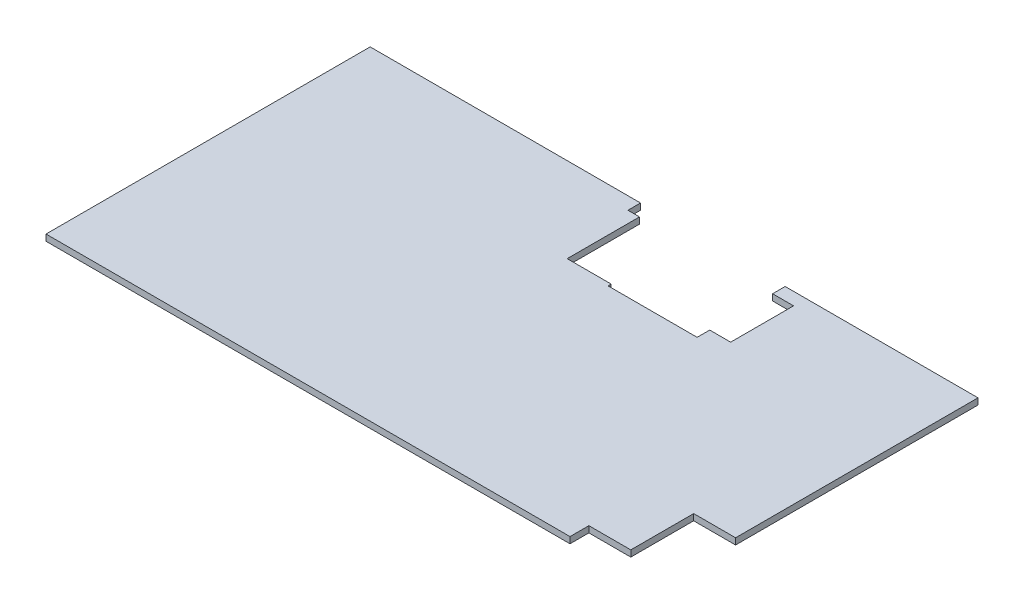
ISO-10303-21;
HEADER;
FILE_DESCRIPTION(('STEP AP214'),'2;1');
FILE_NAME('part.step','',(''),(''),'','','');
FILE_SCHEMA(('AUTOMOTIVE_DESIGN { 1 0 10303 214 1 1 1 1 }'));
ENDSEC;
DATA;
#1=APPLICATION_CONTEXT('core data for automotive mechanical design processes');
#2=APPLICATION_PROTOCOL_DEFINITION('international standard','automotive_design',2000,#1);
#3=PRODUCT_CONTEXT('',#1,'mechanical');
#4=PRODUCT('Part','Part','',(#3));
#5=PRODUCT_RELATED_PRODUCT_CATEGORY('part','',(#4));
#6=PRODUCT_DEFINITION_FORMATION('','',#4);
#7=PRODUCT_DEFINITION_CONTEXT('part definition',#1,'design');
#8=PRODUCT_DEFINITION('design','',#6,#7);
#9=PRODUCT_DEFINITION_SHAPE('','',#8);
#10=(LENGTH_UNIT() NAMED_UNIT(*) SI_UNIT(.MILLI.,.METRE.));
#11=(NAMED_UNIT(*) PLANE_ANGLE_UNIT() SI_UNIT($,.RADIAN.));
#12=(NAMED_UNIT(*) SI_UNIT($,.STERADIAN.) SOLID_ANGLE_UNIT());
#13=UNCERTAINTY_MEASURE_WITH_UNIT(LENGTH_MEASURE(1.E-05),#10,'distance_accuracy_value','');
#14=(GEOMETRIC_REPRESENTATION_CONTEXT(3) GLOBAL_UNCERTAINTY_ASSIGNED_CONTEXT((#13)) GLOBAL_UNIT_ASSIGNED_CONTEXT((#10,
#11,#12)) REPRESENTATION_CONTEXT('',''));
#15=CARTESIAN_POINT('',(0.,0.,0.));
#16=DIRECTION('',(0.,0.,1.));
#17=DIRECTION('',(1.,0.,0.));
#18=AXIS2_PLACEMENT_3D('',#15,#16,#17);
#19=CARTESIAN_POINT('',(0.,3.,0.));
#20=DIRECTION('',(0.,-1.,0.));
#21=DIRECTION('',(0.,0.,-1.));
#22=AXIS2_PLACEMENT_3D('',#19,#20,#21);
#23=PLANE('',#22);
#24=DIRECTION('',(1.,0.,0.));
#25=VECTOR('',#24,1.);
#26=CARTESIAN_POINT('',(145.,3.,68.325));
#27=LINE('',#26,#25);
#28=CARTESIAN_POINT('',(105.,3.,68.325));
#29=VERTEX_POINT('',#28);
#30=CARTESIAN_POINT('',(125.,3.,68.325));
#31=VERTEX_POINT('',#30);
#32=EDGE_CURVE('E268',#29,#31,#27,.T.);
#33=ORIENTED_EDGE('',*,*,#32,.T.);
#34=DIRECTION('',(0.,0.,1.));
#35=VECTOR('',#34,1.);
#36=CARTESIAN_POINT('',(125.,3.,68.325));
#37=LINE('',#36,#35);
#38=CARTESIAN_POINT('',(125.,3.,38.325));
#39=VERTEX_POINT('',#38);
#40=EDGE_CURVE('E51',#39,#31,#37,.T.);
#41=ORIENTED_EDGE('',*,*,#40,.F.);
#42=DIRECTION('',(-1.,0.,0.));
#43=VECTOR('',#42,1.);
#44=CARTESIAN_POINT('',(145.,3.,38.325));
#45=LINE('',#44,#43);
#46=CARTESIAN_POINT('',(145.,3.,38.325));
#47=VERTEX_POINT('',#46);
#48=EDGE_CURVE('E257',#47,#39,#45,.T.);
#49=ORIENTED_EDGE('',*,*,#48,.F.);
#50=DIRECTION('',(0.,0.,-1.));
#51=VECTOR('',#50,1.);
#52=CARTESIAN_POINT('',(145.,3.,-77.325));
#53=LINE('',#52,#51);
#54=CARTESIAN_POINT('',(145.,3.,-77.325));
#55=VERTEX_POINT('',#54);
#56=EDGE_CURVE('E191',#47,#55,#53,.T.);
#57=ORIENTED_EDGE('',*,*,#56,.T.);
#58=DIRECTION('',(-1.,0.,0.));
#59=VECTOR('',#58,1.);
#60=CARTESIAN_POINT('',(145.,3.,-77.325));
#61=LINE('',#60,#59);
#62=CARTESIAN_POINT('',(53.,3.,-77.325));
#63=VERTEX_POINT('',#62);
#64=EDGE_CURVE('E210',#55,#63,#61,.T.);
#65=ORIENTED_EDGE('',*,*,#64,.T.);
#66=DIRECTION('',(0.,0.,1.));
#67=VECTOR('',#66,1.);
#68=CARTESIAN_POINT('',(53.,3.,0.));
#69=LINE('',#68,#67);
#70=CARTESIAN_POINT('',(53.,3.,-71.325));
#71=VERTEX_POINT('',#70);
#72=EDGE_CURVE('E326',#63,#71,#69,.T.);
#73=ORIENTED_EDGE('',*,*,#72,.T.);
#74=DIRECTION('',(-1.,0.,0.));
#75=VECTOR('',#74,1.);
#76=CARTESIAN_POINT('',(0.,3.,-71.325));
#77=LINE('',#76,#75);
#78=CARTESIAN_POINT('',(63.,3.,-71.325));
#79=VERTEX_POINT('',#78);
#80=EDGE_CURVE('E59',#79,#71,#77,.T.);
#81=ORIENTED_EDGE('',*,*,#80,.F.);
#82=DIRECTION('',(0.,0.,-1.));
#83=VECTOR('',#82,1.);
#84=CARTESIAN_POINT('',(63.,3.,0.));
#85=LINE('',#84,#83);
#86=CARTESIAN_POINT('',(63.,3.,-41.325));
#87=VERTEX_POINT('',#86);
#88=EDGE_CURVE('E278',#87,#79,#85,.T.);
#89=ORIENTED_EDGE('',*,*,#88,.F.);
#90=DIRECTION('',(-1.,0.,0.));
#91=VECTOR('',#90,1.);
#92=CARTESIAN_POINT('',(0.,3.,-41.325));
#93=LINE('',#92,#91);
#94=CARTESIAN_POINT('',(53.,3.,-41.325));
#95=VERTEX_POINT('',#94);
#96=EDGE_CURVE('E284',#87,#95,#93,.T.);
#97=ORIENTED_EDGE('',*,*,#96,.T.);
#98=CARTESIAN_POINT('',(53.,3.,-35.325));
#99=VERTEX_POINT('',#98);
#100=EDGE_CURVE('E325',#95,#99,#69,.T.);
#101=ORIENTED_EDGE('',*,*,#100,.T.);
#102=DIRECTION('',(1.,0.,0.));
#103=VECTOR('',#102,1.);
#104=CARTESIAN_POINT('',(0.,3.,-35.325));
#105=LINE('',#104,#103);
#106=CARTESIAN_POINT('',(10.5,3.,-35.325));
#107=VERTEX_POINT('',#106);
#108=EDGE_CURVE('E297',#107,#99,#105,.T.);
#109=ORIENTED_EDGE('',*,*,#108,.F.);
#110=DIRECTION('',(0.,0.,1.));
#111=VECTOR('',#110,1.);
#112=CARTESIAN_POINT('',(10.5,3.,0.));
#113=LINE('',#112,#111);
#114=CARTESIAN_POINT('',(10.5,3.,-36.825));
#115=VERTEX_POINT('',#114);
#116=EDGE_CURVE('E237',#115,#107,#113,.T.);
#117=ORIENTED_EDGE('',*,*,#116,.F.);
#118=DIRECTION('',(1.,0.,0.));
#119=VECTOR('',#118,1.);
#120=CARTESIAN_POINT('',(0.,3.,-36.825));
#121=LINE('',#120,#119);
#122=CARTESIAN_POINT('',(-10.5,3.,-36.825));
#123=VERTEX_POINT('',#122);
#124=EDGE_CURVE('E336',#123,#115,#121,.T.);
#125=ORIENTED_EDGE('',*,*,#124,.F.);
#126=DIRECTION('',(0.,0.,1.));
#127=VECTOR('',#126,1.);
#128=CARTESIAN_POINT('',(-10.5,3.,0.));
#129=LINE('',#128,#127);
#130=CARTESIAN_POINT('',(-10.5,3.,-71.325));
#131=VERTEX_POINT('',#130);
#132=EDGE_CURVE('E334',#131,#123,#129,.T.);
#133=ORIENTED_EDGE('',*,*,#132,.F.);
#134=DIRECTION('',(1.,0.,0.));
#135=VECTOR('',#134,1.);
#136=CARTESIAN_POINT('',(0.,3.,-71.325));
#137=LINE('',#136,#135);
#138=CARTESIAN_POINT('',(-16.,3.,-71.325));
#139=VERTEX_POINT('',#138);
#140=EDGE_CURVE('E331',#139,#131,#137,.T.);
#141=ORIENTED_EDGE('',*,*,#140,.F.);
#142=DIRECTION('',(0.,0.,1.));
#143=VECTOR('',#142,1.);
#144=CARTESIAN_POINT('',(-16.,3.,0.));
#145=LINE('',#144,#143);
#146=CARTESIAN_POINT('',(-16.,3.,-77.325));
#147=VERTEX_POINT('',#146);
#148=EDGE_CURVE('E328',#147,#139,#145,.T.);
#149=ORIENTED_EDGE('',*,*,#148,.F.);
#150=CARTESIAN_POINT('',(-145.,3.,-77.325));
#151=VERTEX_POINT('',#150);
#152=EDGE_CURVE('E219',#147,#151,#61,.T.);
#153=ORIENTED_EDGE('',*,*,#152,.T.);
#154=DIRECTION('',(0.,0.,1.));
#155=VECTOR('',#154,1.);
#156=CARTESIAN_POINT('',(-145.,3.,-77.325));
#157=LINE('',#156,#155);
#158=CARTESIAN_POINT('',(-145.,3.,77.325));
#159=VERTEX_POINT('',#158);
#160=EDGE_CURVE('E207',#151,#159,#157,.T.);
#161=ORIENTED_EDGE('',*,*,#160,.T.);
#162=DIRECTION('',(1.,0.,0.));
#163=VECTOR('',#162,1.);
#164=CARTESIAN_POINT('',(145.,3.,77.325));
#165=LINE('',#164,#163);
#166=CARTESIAN_POINT('',(105.,3.,77.325));
#167=VERTEX_POINT('',#166);
#168=EDGE_CURVE('E253',#159,#167,#165,.T.);
#169=ORIENTED_EDGE('',*,*,#168,.T.);
#170=DIRECTION('',(0.,0.,-1.));
#171=VECTOR('',#170,1.);
#172=CARTESIAN_POINT('',(105.,3.,77.325));
#173=LINE('',#172,#171);
#174=EDGE_CURVE('E266',#167,#29,#173,.T.);
#175=ORIENTED_EDGE('',*,*,#174,.T.);
#176=EDGE_LOOP('',(#33,#41,#49,#57,#65,#73,#81,#89,#97,#101,#109,#117,#125,#133,#141,#149,#153,
#161,#169,#175));
#177=FACE_BOUND('',#176,.T.);
#178=ADVANCED_FACE('F36',(#177),#23,.F.);
#179=CARTESIAN_POINT('',(0.,0.,0.));
#180=DIRECTION('',(0.,-1.,0.));
#181=DIRECTION('',(0.,0.,-1.));
#182=AXIS2_PLACEMENT_3D('',#179,#180,#181);
#183=PLANE('',#182);
#184=DIRECTION('',(0.,0.,1.));
#185=VECTOR('',#184,1.);
#186=CARTESIAN_POINT('',(125.,0.,68.325));
#187=LINE('',#186,#185);
#188=CARTESIAN_POINT('',(125.,0.,38.325));
#189=VERTEX_POINT('',#188);
#190=CARTESIAN_POINT('',(125.,0.,68.325));
#191=VERTEX_POINT('',#190);
#192=EDGE_CURVE('E183',#189,#191,#187,.T.);
#193=ORIENTED_EDGE('',*,*,#192,.T.);
#194=DIRECTION('',(1.,0.,0.));
#195=VECTOR('',#194,1.);
#196=CARTESIAN_POINT('',(145.,0.,68.325));
#197=LINE('',#196,#195);
#198=CARTESIAN_POINT('',(105.,0.,68.325));
#199=VERTEX_POINT('',#198);
#200=EDGE_CURVE('E269',#199,#191,#197,.T.);
#201=ORIENTED_EDGE('',*,*,#200,.F.);
#202=DIRECTION('',(0.,0.,-1.));
#203=VECTOR('',#202,1.);
#204=CARTESIAN_POINT('',(105.,0.,77.325));
#205=LINE('',#204,#203);
#206=CARTESIAN_POINT('',(105.,0.,77.325));
#207=VERTEX_POINT('',#206);
#208=EDGE_CURVE('E264',#207,#199,#205,.T.);
#209=ORIENTED_EDGE('',*,*,#208,.F.);
#210=DIRECTION('',(1.,0.,0.));
#211=VECTOR('',#210,1.);
#212=CARTESIAN_POINT('',(145.,0.,77.325));
#213=LINE('',#212,#211);
#214=CARTESIAN_POINT('',(-145.,0.,77.325));
#215=VERTEX_POINT('',#214);
#216=EDGE_CURVE('E199',#215,#207,#213,.T.);
#217=ORIENTED_EDGE('',*,*,#216,.F.);
#218=DIRECTION('',(0.,0.,1.));
#219=VECTOR('',#218,1.);
#220=CARTESIAN_POINT('',(-145.,0.,-77.325));
#221=LINE('',#220,#219);
#222=CARTESIAN_POINT('',(-145.,0.,-77.325));
#223=VERTEX_POINT('',#222);
#224=EDGE_CURVE('E203',#223,#215,#221,.T.);
#225=ORIENTED_EDGE('',*,*,#224,.F.);
#226=DIRECTION('',(-1.,0.,0.));
#227=VECTOR('',#226,1.);
#228=CARTESIAN_POINT('',(145.,0.,-77.325));
#229=LINE('',#228,#227);
#230=CARTESIAN_POINT('',(-16.,0.,-77.325));
#231=VERTEX_POINT('',#230);
#232=EDGE_CURVE('E198',#231,#223,#229,.T.);
#233=ORIENTED_EDGE('',*,*,#232,.F.);
#234=DIRECTION('',(0.,0.,1.));
#235=VECTOR('',#234,1.);
#236=CARTESIAN_POINT('',(-16.,0.,0.));
#237=LINE('',#236,#235);
#238=CARTESIAN_POINT('',(-16.,0.,-71.325));
#239=VERTEX_POINT('',#238);
#240=EDGE_CURVE('E310',#231,#239,#237,.T.);
#241=ORIENTED_EDGE('',*,*,#240,.T.);
#242=DIRECTION('',(1.,0.,0.));
#243=VECTOR('',#242,1.);
#244=CARTESIAN_POINT('',(0.,0.,-71.325));
#245=LINE('',#244,#243);
#246=CARTESIAN_POINT('',(-10.5,0.,-71.325));
#247=VERTEX_POINT('',#246);
#248=EDGE_CURVE('E313',#239,#247,#245,.T.);
#249=ORIENTED_EDGE('',*,*,#248,.T.);
#250=DIRECTION('',(0.,0.,1.));
#251=VECTOR('',#250,1.);
#252=CARTESIAN_POINT('',(-10.5,0.,0.));
#253=LINE('',#252,#251);
#254=CARTESIAN_POINT('',(-10.5,0.,-36.825));
#255=VERTEX_POINT('',#254);
#256=EDGE_CURVE('E316',#247,#255,#253,.T.);
#257=ORIENTED_EDGE('',*,*,#256,.T.);
#258=DIRECTION('',(1.,0.,0.));
#259=VECTOR('',#258,1.);
#260=CARTESIAN_POINT('',(0.,0.,-36.825));
#261=LINE('',#260,#259);
#262=CARTESIAN_POINT('',(10.5,0.,-36.825));
#263=VERTEX_POINT('',#262);
#264=EDGE_CURVE('E319',#255,#263,#261,.T.);
#265=ORIENTED_EDGE('',*,*,#264,.T.);
#266=DIRECTION('',(0.,0.,1.));
#267=VECTOR('',#266,1.);
#268=CARTESIAN_POINT('',(10.5,0.,0.));
#269=LINE('',#268,#267);
#270=CARTESIAN_POINT('',(10.5,0.,-35.325));
#271=VERTEX_POINT('',#270);
#272=EDGE_CURVE('E251',#263,#271,#269,.T.);
#273=ORIENTED_EDGE('',*,*,#272,.T.);
#274=DIRECTION('',(1.,0.,0.));
#275=VECTOR('',#274,1.);
#276=CARTESIAN_POINT('',(0.,0.,-35.325));
#277=LINE('',#276,#275);
#278=CARTESIAN_POINT('',(53.,0.,-35.325));
#279=VERTEX_POINT('',#278);
#280=EDGE_CURVE('E303',#271,#279,#277,.T.);
#281=ORIENTED_EDGE('',*,*,#280,.T.);
#282=DIRECTION('',(0.,0.,1.));
#283=VECTOR('',#282,1.);
#284=CARTESIAN_POINT('',(53.,0.,0.));
#285=LINE('',#284,#283);
#286=CARTESIAN_POINT('',(53.,0.,-41.325));
#287=VERTEX_POINT('',#286);
#288=EDGE_CURVE('E306',#287,#279,#285,.T.);
#289=ORIENTED_EDGE('',*,*,#288,.F.);
#290=DIRECTION('',(-1.,0.,0.));
#291=VECTOR('',#290,1.);
#292=CARTESIAN_POINT('',(0.,0.,-41.325));
#293=LINE('',#292,#291);
#294=CARTESIAN_POINT('',(63.,0.,-41.325));
#295=VERTEX_POINT('',#294);
#296=EDGE_CURVE('E287',#295,#287,#293,.T.);
#297=ORIENTED_EDGE('',*,*,#296,.F.);
#298=DIRECTION('',(0.,0.,-1.));
#299=VECTOR('',#298,1.);
#300=CARTESIAN_POINT('',(63.,0.,0.));
#301=LINE('',#300,#299);
#302=CARTESIAN_POINT('',(63.,0.,-71.325));
#303=VERTEX_POINT('',#302);
#304=EDGE_CURVE('E280',#295,#303,#301,.T.);
#305=ORIENTED_EDGE('',*,*,#304,.T.);
#306=DIRECTION('',(-1.,0.,0.));
#307=VECTOR('',#306,1.);
#308=CARTESIAN_POINT('',(0.,0.,-71.325));
#309=LINE('',#308,#307);
#310=CARTESIAN_POINT('',(53.,0.,-71.325));
#311=VERTEX_POINT('',#310);
#312=EDGE_CURVE('E283',#303,#311,#309,.T.);
#313=ORIENTED_EDGE('',*,*,#312,.T.);
#314=CARTESIAN_POINT('',(53.,0.,-77.325));
#315=VERTEX_POINT('',#314);
#316=EDGE_CURVE('E307',#315,#311,#285,.T.);
#317=ORIENTED_EDGE('',*,*,#316,.F.);
#318=CARTESIAN_POINT('',(145.,0.,-77.325));
#319=VERTEX_POINT('',#318);
#320=EDGE_CURVE('E197',#319,#315,#229,.T.);
#321=ORIENTED_EDGE('',*,*,#320,.F.);
#322=DIRECTION('',(0.,0.,-1.));
#323=VECTOR('',#322,1.);
#324=CARTESIAN_POINT('',(145.,0.,-77.325));
#325=LINE('',#324,#323);
#326=CARTESIAN_POINT('',(145.,0.,38.325));
#327=VERTEX_POINT('',#326);
#328=EDGE_CURVE('E189',#327,#319,#325,.T.);
#329=ORIENTED_EDGE('',*,*,#328,.F.);
#330=DIRECTION('',(-1.,0.,0.));
#331=VECTOR('',#330,1.);
#332=CARTESIAN_POINT('',(145.,0.,38.325));
#333=LINE('',#332,#331);
#334=EDGE_CURVE('E172',#327,#189,#333,.T.);
#335=ORIENTED_EDGE('',*,*,#334,.T.);
#336=EDGE_LOOP('',(#193,#201,#209,#217,#225,#233,#241,#249,#257,#265,#273,#281,#289,#297,#305,
#313,#317,#321,#329,#335));
#337=FACE_BOUND('',#336,.T.);
#338=ADVANCED_FACE('F194',(#337),#183,.T.);
#339=CARTESIAN_POINT('',(53.,0.,0.));
#340=DIRECTION('',(-1.,0.,0.));
#341=DIRECTION('',(0.,0.,1.));
#342=AXIS2_PLACEMENT_3D('',#339,#340,#341);
#343=PLANE('',#342);
#344=ORIENTED_EDGE('',*,*,#100,.F.);
#345=DIRECTION('',(0.,1.,0.));
#346=VECTOR('',#345,1.);
#347=CARTESIAN_POINT('',(53.,0.,-41.325));
#348=LINE('',#347,#346);
#349=EDGE_CURVE('E298',#287,#95,#348,.T.);
#350=ORIENTED_EDGE('',*,*,#349,.F.);
#351=ORIENTED_EDGE('',*,*,#288,.T.);
#352=DIRECTION('',(0.,1.,0.));
#353=VECTOR('',#352,1.);
#354=CARTESIAN_POINT('',(53.,0.,-35.325));
#355=LINE('',#354,#353);
#356=EDGE_CURVE('E248',#279,#99,#355,.T.);
#357=ORIENTED_EDGE('',*,*,#356,.T.);
#358=EDGE_LOOP('',(#344,#350,#351,#357));
#359=FACE_BOUND('',#358,.T.);
#360=ADVANCED_FACE('F381',(#359),#343,.T.);
#361=CARTESIAN_POINT('',(145.,3.,-77.325));
#362=DIRECTION('',(0.,0.,1.));
#363=DIRECTION('',(1.,0.,0.));
#364=AXIS2_PLACEMENT_3D('',#361,#362,#363);
#365=PLANE('',#364);
#366=DIRECTION('',(0.,1.,0.));
#367=VECTOR('',#366,1.);
#368=CARTESIAN_POINT('',(53.,0.,-77.325));
#369=LINE('',#368,#367);
#370=EDGE_CURVE('E216',#315,#63,#369,.T.);
#371=ORIENTED_EDGE('',*,*,#370,.T.);
#372=ORIENTED_EDGE('',*,*,#64,.F.);
#373=DIRECTION('',(0.,-1.,0.));
#374=VECTOR('',#373,1.);
#375=CARTESIAN_POINT('',(145.,3.,-77.325));
#376=LINE('',#375,#374);
#377=EDGE_CURVE('E44',#55,#319,#376,.T.);
#378=ORIENTED_EDGE('',*,*,#377,.T.);
#379=ORIENTED_EDGE('',*,*,#320,.T.);
#380=EDGE_LOOP('',(#371,#372,#378,#379));
#381=FACE_BOUND('',#380,.T.);
#382=ADVANCED_FACE('F214',(#381),#365,.F.);
#383=CARTESIAN_POINT('',(-145.,3.,-77.325));
#384=DIRECTION('',(1.,0.,0.));
#385=DIRECTION('',(0.,0.,-1.));
#386=AXIS2_PLACEMENT_3D('',#383,#384,#385);
#387=PLANE('',#386);
#388=ORIENTED_EDGE('',*,*,#224,.T.);
#389=DIRECTION('',(0.,-1.,0.));
#390=VECTOR('',#389,1.);
#391=CARTESIAN_POINT('',(-145.,3.,77.325));
#392=LINE('',#391,#390);
#393=EDGE_CURVE('E11',#159,#215,#392,.T.);
#394=ORIENTED_EDGE('',*,*,#393,.F.);
#395=ORIENTED_EDGE('',*,*,#160,.F.);
#396=DIRECTION('',(0.,-1.,0.));
#397=VECTOR('',#396,1.);
#398=CARTESIAN_POINT('',(-145.,3.,-77.325));
#399=LINE('',#398,#397);
#400=EDGE_CURVE('E208',#151,#223,#399,.T.);
#401=ORIENTED_EDGE('',*,*,#400,.T.);
#402=EDGE_LOOP('',(#388,#394,#395,#401));
#403=FACE_BOUND('',#402,.T.);
#404=ADVANCED_FACE('F38',(#403),#387,.F.);
#405=CARTESIAN_POINT('',(145.,3.,77.325));
#406=DIRECTION('',(0.,0.,-1.));
#407=DIRECTION('',(-1.,0.,0.));
#408=AXIS2_PLACEMENT_3D('',#405,#406,#407);
#409=PLANE('',#408);
#410=ORIENTED_EDGE('',*,*,#216,.T.);
#411=DIRECTION('',(0.,-1.,0.));
#412=VECTOR('',#411,1.);
#413=CARTESIAN_POINT('',(105.,3.,77.325));
#414=LINE('',#413,#412);
#415=EDGE_CURVE('E271',#167,#207,#414,.T.);
#416=ORIENTED_EDGE('',*,*,#415,.F.);
#417=ORIENTED_EDGE('',*,*,#168,.F.);
#418=ORIENTED_EDGE('',*,*,#393,.T.);
#419=EDGE_LOOP('',(#410,#416,#417,#418));
#420=FACE_BOUND('',#419,.T.);
#421=ADVANCED_FACE('F374',(#420),#409,.F.);
#422=CARTESIAN_POINT('',(145.,3.,-77.325));
#423=DIRECTION('',(-1.,0.,0.));
#424=DIRECTION('',(0.,0.,1.));
#425=AXIS2_PLACEMENT_3D('',#422,#423,#424);
#426=PLANE('',#425);
#427=ORIENTED_EDGE('',*,*,#56,.F.);
#428=DIRECTION('',(0.,1.,0.));
#429=VECTOR('',#428,1.);
#430=CARTESIAN_POINT('',(145.,0.,38.325));
#431=LINE('',#430,#429);
#432=EDGE_CURVE('E176',#327,#47,#431,.T.);
#433=ORIENTED_EDGE('',*,*,#432,.F.);
#434=ORIENTED_EDGE('',*,*,#328,.T.);
#435=ORIENTED_EDGE('',*,*,#377,.F.);
#436=EDGE_LOOP('',(#427,#433,#434,#435));
#437=FACE_BOUND('',#436,.T.);
#438=ADVANCED_FACE('F187',(#437),#426,.F.);
#439=ORIENTED_EDGE('',*,*,#152,.F.);
#440=DIRECTION('',(0.,1.,0.));
#441=VECTOR('',#440,1.);
#442=CARTESIAN_POINT('',(-16.,0.,-77.325));
#443=LINE('',#442,#441);
#444=EDGE_CURVE('E245',#231,#147,#443,.T.);
#445=ORIENTED_EDGE('',*,*,#444,.F.);
#446=ORIENTED_EDGE('',*,*,#232,.T.);
#447=ORIENTED_EDGE('',*,*,#400,.F.);
#448=EDGE_LOOP('',(#439,#445,#446,#447));
#449=FACE_BOUND('',#448,.T.);
#450=ADVANCED_FACE('F368',(#449),#365,.F.);
#451=CARTESIAN_POINT('',(0.,0.,-35.325));
#452=DIRECTION('',(0.,0.,1.));
#453=DIRECTION('',(1.,0.,0.));
#454=AXIS2_PLACEMENT_3D('',#451,#452,#453);
#455=PLANE('',#454);
#456=ORIENTED_EDGE('',*,*,#108,.T.);
#457=ORIENTED_EDGE('',*,*,#356,.F.);
#458=ORIENTED_EDGE('',*,*,#280,.F.);
#459=DIRECTION('',(0.,1.,0.));
#460=VECTOR('',#459,1.);
#461=CARTESIAN_POINT('',(10.5,0.,-35.325));
#462=LINE('',#461,#460);
#463=EDGE_CURVE('E224',#271,#107,#462,.T.);
#464=ORIENTED_EDGE('',*,*,#463,.T.);
#465=EDGE_LOOP('',(#456,#457,#458,#464));
#466=FACE_BOUND('',#465,.T.);
#467=ADVANCED_FACE('F347',(#466),#455,.F.);
#468=CARTESIAN_POINT('',(10.5,0.,0.));
#469=DIRECTION('',(-1.,0.,0.));
#470=DIRECTION('',(0.,0.,1.));
#471=AXIS2_PLACEMENT_3D('',#468,#469,#470);
#472=PLANE('',#471);
#473=ORIENTED_EDGE('',*,*,#116,.T.);
#474=ORIENTED_EDGE('',*,*,#463,.F.);
#475=ORIENTED_EDGE('',*,*,#272,.F.);
#476=DIRECTION('',(0.,1.,0.));
#477=VECTOR('',#476,1.);
#478=CARTESIAN_POINT('',(10.5,0.,-36.825));
#479=LINE('',#478,#477);
#480=EDGE_CURVE('E228',#263,#115,#479,.T.);
#481=ORIENTED_EDGE('',*,*,#480,.T.);
#482=EDGE_LOOP('',(#473,#474,#475,#481));
#483=FACE_BOUND('',#482,.T.);
#484=ADVANCED_FACE('F343',(#483),#472,.F.);
#485=CARTESIAN_POINT('',(0.,0.,-36.825));
#486=DIRECTION('',(0.,0.,1.));
#487=DIRECTION('',(1.,0.,0.));
#488=AXIS2_PLACEMENT_3D('',#485,#486,#487);
#489=PLANE('',#488);
#490=ORIENTED_EDGE('',*,*,#124,.T.);
#491=ORIENTED_EDGE('',*,*,#480,.F.);
#492=ORIENTED_EDGE('',*,*,#264,.F.);
#493=DIRECTION('',(0.,1.,0.));
#494=VECTOR('',#493,1.);
#495=CARTESIAN_POINT('',(-10.5,0.,-36.825));
#496=LINE('',#495,#494);
#497=EDGE_CURVE('E234',#255,#123,#496,.T.);
#498=ORIENTED_EDGE('',*,*,#497,.T.);
#499=EDGE_LOOP('',(#490,#491,#492,#498));
#500=FACE_BOUND('',#499,.T.);
#501=ADVANCED_FACE('F353',(#500),#489,.F.);
#502=CARTESIAN_POINT('',(-10.5,0.,0.));
#503=DIRECTION('',(-1.,0.,0.));
#504=DIRECTION('',(0.,0.,1.));
#505=AXIS2_PLACEMENT_3D('',#502,#503,#504);
#506=PLANE('',#505);
#507=ORIENTED_EDGE('',*,*,#132,.T.);
#508=ORIENTED_EDGE('',*,*,#497,.F.);
#509=ORIENTED_EDGE('',*,*,#256,.F.);
#510=DIRECTION('',(0.,1.,0.));
#511=VECTOR('',#510,1.);
#512=CARTESIAN_POINT('',(-10.5,0.,-71.325));
#513=LINE('',#512,#511);
#514=EDGE_CURVE('E241',#247,#131,#513,.T.);
#515=ORIENTED_EDGE('',*,*,#514,.T.);
#516=EDGE_LOOP('',(#507,#508,#509,#515));
#517=FACE_BOUND('',#516,.T.);
#518=ADVANCED_FACE('F356',(#517),#506,.F.);
#519=CARTESIAN_POINT('',(0.,0.,-71.325));
#520=DIRECTION('',(0.,0.,1.));
#521=DIRECTION('',(1.,0.,0.));
#522=AXIS2_PLACEMENT_3D('',#519,#520,#521);
#523=PLANE('',#522);
#524=ORIENTED_EDGE('',*,*,#140,.T.);
#525=ORIENTED_EDGE('',*,*,#514,.F.);
#526=ORIENTED_EDGE('',*,*,#248,.F.);
#527=DIRECTION('',(0.,1.,0.));
#528=VECTOR('',#527,1.);
#529=CARTESIAN_POINT('',(-16.,0.,-71.325));
#530=LINE('',#529,#528);
#531=EDGE_CURVE('E243',#239,#139,#530,.T.);
#532=ORIENTED_EDGE('',*,*,#531,.T.);
#533=EDGE_LOOP('',(#524,#525,#526,#532));
#534=FACE_BOUND('',#533,.T.);
#535=ADVANCED_FACE('F361',(#534),#523,.F.);
#536=CARTESIAN_POINT('',(-16.,0.,0.));
#537=DIRECTION('',(-1.,0.,0.));
#538=DIRECTION('',(0.,0.,1.));
#539=AXIS2_PLACEMENT_3D('',#536,#537,#538);
#540=PLANE('',#539);
#541=ORIENTED_EDGE('',*,*,#148,.T.);
#542=ORIENTED_EDGE('',*,*,#531,.F.);
#543=ORIENTED_EDGE('',*,*,#240,.F.);
#544=ORIENTED_EDGE('',*,*,#444,.T.);
#545=EDGE_LOOP('',(#541,#542,#543,#544));
#546=FACE_BOUND('',#545,.T.);
#547=ADVANCED_FACE('F364',(#546),#540,.F.);
#548=DIRECTION('',(0.,1.,0.));
#549=VECTOR('',#548,1.);
#550=CARTESIAN_POINT('',(53.,0.,-71.325));
#551=LINE('',#550,#549);
#552=EDGE_CURVE('E300',#311,#71,#551,.T.);
#553=ORIENTED_EDGE('',*,*,#552,.T.);
#554=ORIENTED_EDGE('',*,*,#72,.F.);
#555=ORIENTED_EDGE('',*,*,#370,.F.);
#556=ORIENTED_EDGE('',*,*,#316,.T.);
#557=EDGE_LOOP('',(#553,#554,#555,#556));
#558=FACE_BOUND('',#557,.T.);
#559=ADVANCED_FACE('F440',(#558),#343,.T.);
#560=CARTESIAN_POINT('',(63.,0.,0.));
#561=DIRECTION('',(1.,0.,0.));
#562=DIRECTION('',(0.,0.,-1.));
#563=AXIS2_PLACEMENT_3D('',#560,#561,#562);
#564=PLANE('',#563);
#565=ORIENTED_EDGE('',*,*,#88,.T.);
#566=DIRECTION('',(0.,1.,0.));
#567=VECTOR('',#566,1.);
#568=CARTESIAN_POINT('',(63.,0.,-71.325));
#569=LINE('',#568,#567);
#570=EDGE_CURVE('E289',#303,#79,#569,.T.);
#571=ORIENTED_EDGE('',*,*,#570,.F.);
#572=ORIENTED_EDGE('',*,*,#304,.F.);
#573=DIRECTION('',(0.,1.,0.));
#574=VECTOR('',#573,1.);
#575=CARTESIAN_POINT('',(63.,0.,-41.325));
#576=LINE('',#575,#574);
#577=EDGE_CURVE('E295',#295,#87,#576,.T.);
#578=ORIENTED_EDGE('',*,*,#577,.T.);
#579=EDGE_LOOP('',(#565,#571,#572,#578));
#580=FACE_BOUND('',#579,.T.);
#581=ADVANCED_FACE('F448',(#580),#564,.F.);
#582=CARTESIAN_POINT('',(0.,0.,-41.325));
#583=DIRECTION('',(0.,0.,-1.));
#584=DIRECTION('',(-1.,0.,0.));
#585=AXIS2_PLACEMENT_3D('',#582,#583,#584);
#586=PLANE('',#585);
#587=ORIENTED_EDGE('',*,*,#96,.F.);
#588=ORIENTED_EDGE('',*,*,#577,.F.);
#589=ORIENTED_EDGE('',*,*,#296,.T.);
#590=ORIENTED_EDGE('',*,*,#349,.T.);
#591=EDGE_LOOP('',(#587,#588,#589,#590));
#592=FACE_BOUND('',#591,.T.);
#593=ADVANCED_FACE('F455',(#592),#586,.T.);
#594=CARTESIAN_POINT('',(0.,0.,-71.325));
#595=DIRECTION('',(0.,0.,-1.));
#596=DIRECTION('',(-1.,0.,0.));
#597=AXIS2_PLACEMENT_3D('',#594,#595,#596);
#598=PLANE('',#597);
#599=ORIENTED_EDGE('',*,*,#80,.T.);
#600=ORIENTED_EDGE('',*,*,#552,.F.);
#601=ORIENTED_EDGE('',*,*,#312,.F.);
#602=ORIENTED_EDGE('',*,*,#570,.T.);
#603=EDGE_LOOP('',(#599,#600,#601,#602));
#604=FACE_BOUND('',#603,.T.);
#605=ADVANCED_FACE('F463',(#604),#598,.F.);
#606=CARTESIAN_POINT('',(145.,3.,68.325));
#607=DIRECTION('',(0.,0.,-1.));
#608=DIRECTION('',(-1.,0.,0.));
#609=AXIS2_PLACEMENT_3D('',#606,#607,#608);
#610=PLANE('',#609);
#611=ORIENTED_EDGE('',*,*,#200,.T.);
#612=DIRECTION('',(0.,1.,0.));
#613=VECTOR('',#612,1.);
#614=CARTESIAN_POINT('',(125.,0.,68.325));
#615=LINE('',#614,#613);
#616=EDGE_CURVE('E262',#191,#31,#615,.T.);
#617=ORIENTED_EDGE('',*,*,#616,.T.);
#618=ORIENTED_EDGE('',*,*,#32,.F.);
#619=DIRECTION('',(0.,-1.,0.));
#620=VECTOR('',#619,1.);
#621=CARTESIAN_POINT('',(105.,3.,68.325));
#622=LINE('',#621,#620);
#623=EDGE_CURVE('E276',#29,#199,#622,.T.);
#624=ORIENTED_EDGE('',*,*,#623,.T.);
#625=EDGE_LOOP('',(#611,#617,#618,#624));
#626=FACE_BOUND('',#625,.T.);
#627=ADVANCED_FACE('F471',(#626),#610,.F.);
#628=CARTESIAN_POINT('',(105.,3.,77.325));
#629=DIRECTION('',(-1.,0.,0.));
#630=DIRECTION('',(0.,0.,1.));
#631=AXIS2_PLACEMENT_3D('',#628,#629,#630);
#632=PLANE('',#631);
#633=ORIENTED_EDGE('',*,*,#208,.T.);
#634=ORIENTED_EDGE('',*,*,#623,.F.);
#635=ORIENTED_EDGE('',*,*,#174,.F.);
#636=ORIENTED_EDGE('',*,*,#415,.T.);
#637=EDGE_LOOP('',(#633,#634,#635,#636));
#638=FACE_BOUND('',#637,.T.);
#639=ADVANCED_FACE('F477',(#638),#632,.F.);
#640=CARTESIAN_POINT('',(125.,0.,68.325));
#641=DIRECTION('',(-1.,0.,0.));
#642=DIRECTION('',(0.,0.,1.));
#643=AXIS2_PLACEMENT_3D('',#640,#641,#642);
#644=PLANE('',#643);
#645=ORIENTED_EDGE('',*,*,#40,.T.);
#646=ORIENTED_EDGE('',*,*,#616,.F.);
#647=ORIENTED_EDGE('',*,*,#192,.F.);
#648=DIRECTION('',(0.,1.,0.));
#649=VECTOR('',#648,1.);
#650=CARTESIAN_POINT('',(125.,0.,38.325));
#651=LINE('',#650,#649);
#652=EDGE_CURVE('E178',#189,#39,#651,.T.);
#653=ORIENTED_EDGE('',*,*,#652,.T.);
#654=EDGE_LOOP('',(#645,#646,#647,#653));
#655=FACE_BOUND('',#654,.T.);
#656=ADVANCED_FACE('F486',(#655),#644,.F.);
#657=CARTESIAN_POINT('',(145.,0.,38.325));
#658=DIRECTION('',(0.,0.,-1.));
#659=DIRECTION('',(-1.,0.,0.));
#660=AXIS2_PLACEMENT_3D('',#657,#658,#659);
#661=PLANE('',#660);
#662=ORIENTED_EDGE('',*,*,#48,.T.);
#663=ORIENTED_EDGE('',*,*,#652,.F.);
#664=ORIENTED_EDGE('',*,*,#334,.F.);
#665=ORIENTED_EDGE('',*,*,#432,.T.);
#666=EDGE_LOOP('',(#662,#663,#664,#665));
#667=FACE_BOUND('',#666,.T.);
#668=ADVANCED_FACE('F175',(#667),#661,.F.);
#669=CLOSED_SHELL('',(#178,#338,#360,#382,#404,#421,#438,#450,#467,#484,#501,#518,#535,#547,
#559,#581,#593,#605,#627,#639,#656,#668));
#670=MANIFOLD_SOLID_BREP('B2',#669);
#671=ADVANCED_BREP_SHAPE_REPRESENTATION('',(#18,#670),#14);
#672=SHAPE_DEFINITION_REPRESENTATION(#9,#671);
ENDSEC;
END-ISO-10303-21;
